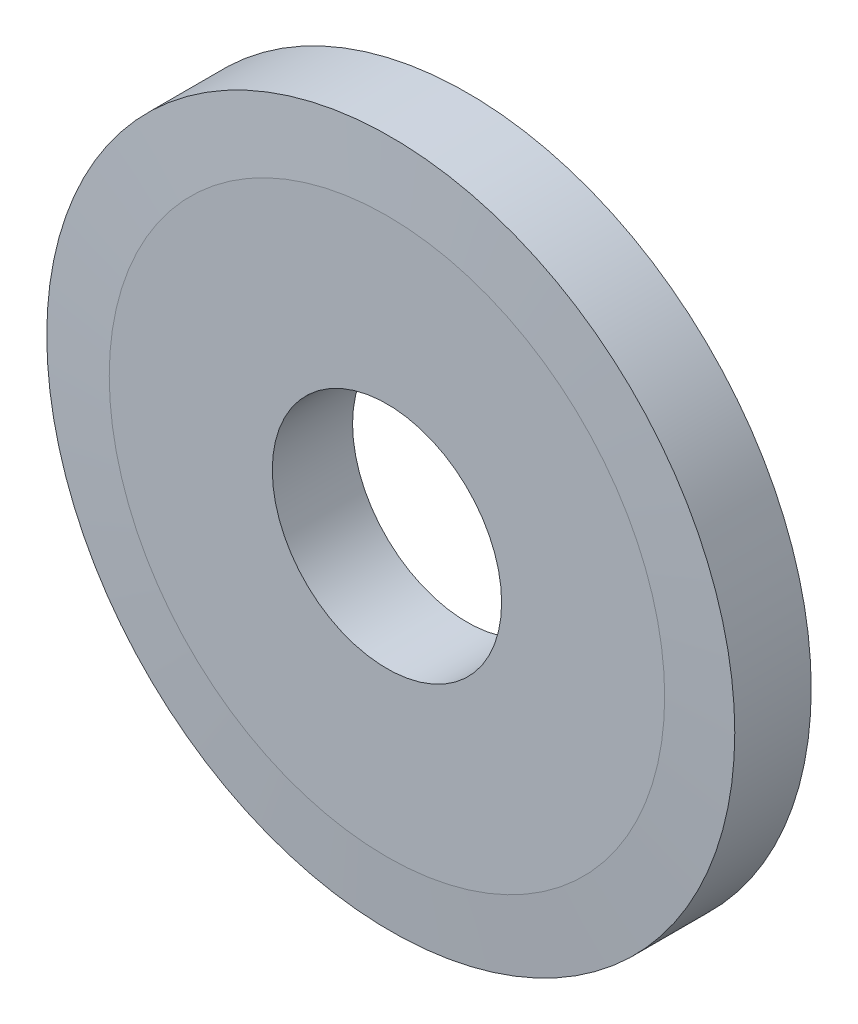
ISO-10303-21;
HEADER;
FILE_DESCRIPTION(('STEP AP214'),'2;1');
FILE_NAME('part.step','',(''),(''),'','','');
FILE_SCHEMA(('AUTOMOTIVE_DESIGN { 1 0 10303 214 1 1 1 1 }'));
ENDSEC;
DATA;
#1=APPLICATION_CONTEXT('core data for automotive mechanical design processes');
#2=APPLICATION_PROTOCOL_DEFINITION('international standard','automotive_design',2000,#1);
#3=PRODUCT_CONTEXT('',#1,'mechanical');
#4=PRODUCT('Part','Part','',(#3));
#5=PRODUCT_RELATED_PRODUCT_CATEGORY('part','',(#4));
#6=PRODUCT_DEFINITION_FORMATION('','',#4);
#7=PRODUCT_DEFINITION_CONTEXT('part definition',#1,'design');
#8=PRODUCT_DEFINITION('design','',#6,#7);
#9=PRODUCT_DEFINITION_SHAPE('','',#8);
#10=(LENGTH_UNIT() NAMED_UNIT(*) SI_UNIT(.MILLI.,.METRE.));
#11=(NAMED_UNIT(*) PLANE_ANGLE_UNIT() SI_UNIT($,.RADIAN.));
#12=(NAMED_UNIT(*) SI_UNIT($,.STERADIAN.) SOLID_ANGLE_UNIT());
#13=UNCERTAINTY_MEASURE_WITH_UNIT(LENGTH_MEASURE(1.E-05),#10,'distance_accuracy_value','');
#14=(GEOMETRIC_REPRESENTATION_CONTEXT(3) GLOBAL_UNCERTAINTY_ASSIGNED_CONTEXT((#13)) GLOBAL_UNIT_ASSIGNED_CONTEXT((#10,
#11,#12)) REPRESENTATION_CONTEXT('',''));
#15=CARTESIAN_POINT('',(0.,0.,0.));
#16=DIRECTION('',(0.,0.,1.));
#17=DIRECTION('',(1.,0.,0.));
#18=AXIS2_PLACEMENT_3D('',#15,#16,#17);
#19=CARTESIAN_POINT('',(0.,0.,0.));
#20=DIRECTION('',(0.,0.,1.));
#21=DIRECTION('',(1.,0.,0.));
#22=AXIS2_PLACEMENT_3D('',#19,#20,#21);
#23=PLANE('',#22);
#24=CARTESIAN_POINT('',(0.,0.,0.));
#25=DIRECTION('',(0.,0.,1.));
#26=DIRECTION('',(1.,0.,0.));
#27=AXIS2_PLACEMENT_3D('',#24,#25,#26);
#28=CIRCLE('',#27,9.);
#29=CARTESIAN_POINT('',(9.,0.,0.));
#30=VERTEX_POINT('',#29);
#31=EDGE_CURVE('E50',#30,#30,#28,.T.);
#32=ORIENTED_EDGE('',*,*,#31,.F.);
#33=EDGE_LOOP('',(#32));
#34=FACE_BOUND('',#33,.T.);
#35=CARTESIAN_POINT('',(0.,0.,0.));
#36=DIRECTION('',(0.,0.,1.));
#37=DIRECTION('',(1.,0.,0.));
#38=AXIS2_PLACEMENT_3D('',#35,#36,#37);
#39=CIRCLE('',#38,3.);
#40=CARTESIAN_POINT('',(3.,0.,0.));
#41=VERTEX_POINT('',#40);
#42=EDGE_CURVE('E57',#41,#41,#39,.T.);
#43=ORIENTED_EDGE('',*,*,#42,.T.);
#44=EDGE_LOOP('',(#43));
#45=FACE_BOUND('',#44,.T.);
#46=ADVANCED_FACE('F43',(#34,#45),#23,.F.);
#47=CARTESIAN_POINT('',(0.,0.,2.));
#48=DIRECTION('',(0.,0.,-1.));
#49=DIRECTION('',(-1.,0.,0.));
#50=AXIS2_PLACEMENT_3D('',#47,#48,#49);
#51=CYLINDRICAL_SURFACE('',#50,9.);
#52=CARTESIAN_POINT('',(0.,0.,2.));
#53=DIRECTION('',(0.,0.,1.));
#54=DIRECTION('',(1.,0.,0.));
#55=AXIS2_PLACEMENT_3D('',#52,#53,#54);
#56=CIRCLE('',#55,9.);
#57=CARTESIAN_POINT('',(9.,0.,2.));
#58=VERTEX_POINT('',#57);
#59=EDGE_CURVE('E10',#58,#58,#56,.T.);
#60=ORIENTED_EDGE('',*,*,#59,.F.);
#61=EDGE_LOOP('',(#60));
#62=FACE_BOUND('',#61,.T.);
#63=ORIENTED_EDGE('',*,*,#31,.T.);
#64=EDGE_LOOP('',(#63));
#65=FACE_BOUND('',#64,.T.);
#66=ADVANCED_FACE('F44',(#62,#65),#51,.T.);
#67=CARTESIAN_POINT('',(0.,0.,2.));
#68=DIRECTION('',(0.,0.,-1.));
#69=DIRECTION('',(-1.,0.,0.));
#70=AXIS2_PLACEMENT_3D('',#67,#68,#69);
#71=CYLINDRICAL_SURFACE('',#70,3.);
#72=ORIENTED_EDGE('',*,*,#42,.F.);
#73=EDGE_LOOP('',(#72));
#74=FACE_BOUND('',#73,.T.);
#75=CARTESIAN_POINT('',(0.,0.,2.1));
#76=DIRECTION('',(0.,0.,-1.));
#77=DIRECTION('',(-1.,0.,0.));
#78=AXIS2_PLACEMENT_3D('',#75,#76,#77);
#79=CIRCLE('',#78,3.);
#80=CARTESIAN_POINT('',(-3.,0.,2.1));
#81=VERTEX_POINT('',#80);
#82=EDGE_CURVE('E63',#81,#81,#79,.T.);
#83=ORIENTED_EDGE('',*,*,#82,.F.);
#84=EDGE_LOOP('',(#83));
#85=FACE_BOUND('',#84,.T.);
#86=ADVANCED_FACE('F71',(#74,#85),#71,.F.);
#87=CARTESIAN_POINT('',(0.,0.,2.));
#88=DIRECTION('',(0.,0.,-1.));
#89=DIRECTION('',(1.,0.,0.));
#90=AXIS2_PLACEMENT_3D('',#87,#88,#89);
#91=CONICAL_SURFACE('',#90,9.,1.51320046147909);
#92=CARTESIAN_POINT('',(0.,0.,2.1));
#93=DIRECTION('',(0.,0.,1.));
#94=DIRECTION('',(1.,0.,0.));
#95=AXIS2_PLACEMENT_3D('',#92,#93,#94);
#96=CIRCLE('',#95,7.26568454407244);
#97=CARTESIAN_POINT('',(7.26568454407244,0.,2.1));
#98=VERTEX_POINT('',#97);
#99=EDGE_CURVE('E62',#98,#98,#96,.T.);
#100=ORIENTED_EDGE('',*,*,#99,.F.);
#101=EDGE_LOOP('',(#100));
#102=FACE_BOUND('',#101,.T.);
#103=ORIENTED_EDGE('',*,*,#59,.T.);
#104=EDGE_LOOP('',(#103));
#105=FACE_BOUND('',#104,.T.);
#106=ADVANCED_FACE('F73',(#102,#105),#91,.T.);
#107=CARTESIAN_POINT('',(0.,0.,2.1));
#108=DIRECTION('',(0.,0.,1.));
#109=DIRECTION('',(1.,0.,0.));
#110=AXIS2_PLACEMENT_3D('',#107,#108,#109);
#111=PLANE('',#110);
#112=ORIENTED_EDGE('',*,*,#82,.T.);
#113=EDGE_LOOP('',(#112));
#114=FACE_BOUND('',#113,.T.);
#115=ORIENTED_EDGE('',*,*,#99,.T.);
#116=EDGE_LOOP('',(#115));
#117=FACE_BOUND('',#116,.T.);
#118=ADVANCED_FACE('F68',(#114,#117),#111,.T.);
#119=CLOSED_SHELL('',(#46,#66,#86,#106,#118));
#120=MANIFOLD_SOLID_BREP('B2',#119);
#121=ADVANCED_BREP_SHAPE_REPRESENTATION('',(#18,#120),#14);
#122=SHAPE_DEFINITION_REPRESENTATION(#9,#121);
ENDSEC;
END-ISO-10303-21;
